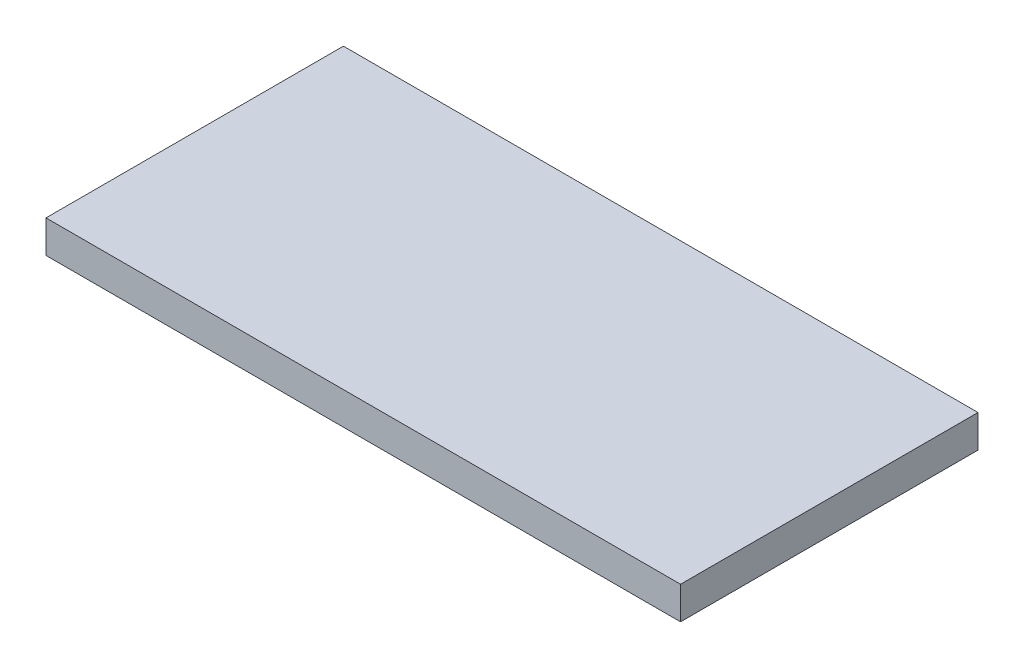
ISO-10303-21;
HEADER;
FILE_DESCRIPTION(('STEP AP214'),'2;1');
FILE_NAME('part.step','',(''),(''),'','','');
FILE_SCHEMA(('AUTOMOTIVE_DESIGN { 1 0 10303 214 1 1 1 1 }'));
ENDSEC;
DATA;
#1=APPLICATION_CONTEXT('core data for automotive mechanical design processes');
#2=APPLICATION_PROTOCOL_DEFINITION('international standard','automotive_design',2000,#1);
#3=PRODUCT_CONTEXT('',#1,'mechanical');
#4=PRODUCT('Part','Part','',(#3));
#5=PRODUCT_RELATED_PRODUCT_CATEGORY('part','',(#4));
#6=PRODUCT_DEFINITION_FORMATION('','',#4);
#7=PRODUCT_DEFINITION_CONTEXT('part definition',#1,'design');
#8=PRODUCT_DEFINITION('design','',#6,#7);
#9=PRODUCT_DEFINITION_SHAPE('','',#8);
#10=(LENGTH_UNIT() NAMED_UNIT(*) SI_UNIT(.MILLI.,.METRE.));
#11=(NAMED_UNIT(*) PLANE_ANGLE_UNIT() SI_UNIT($,.RADIAN.));
#12=(NAMED_UNIT(*) SI_UNIT($,.STERADIAN.) SOLID_ANGLE_UNIT());
#13=UNCERTAINTY_MEASURE_WITH_UNIT(LENGTH_MEASURE(1.E-05),#10,'distance_accuracy_value','');
#14=(GEOMETRIC_REPRESENTATION_CONTEXT(3) GLOBAL_UNCERTAINTY_ASSIGNED_CONTEXT((#13)) GLOBAL_UNIT_ASSIGNED_CONTEXT((#10,
#11,#12)) REPRESENTATION_CONTEXT('',''));
#15=CARTESIAN_POINT('',(0.,0.,0.));
#16=DIRECTION('',(0.,0.,1.));
#17=DIRECTION('',(1.,0.,0.));
#18=AXIS2_PLACEMENT_3D('',#15,#16,#17);
#19=CARTESIAN_POINT('',(-224.,11.5,105.));
#20=DIRECTION('',(1.,0.,0.));
#21=DIRECTION('',(0.,0.,-1.));
#22=AXIS2_PLACEMENT_3D('',#19,#20,#21);
#23=PLANE('',#22);
#24=DIRECTION('',(0.,0.,1.));
#25=VECTOR('',#24,1.);
#26=CARTESIAN_POINT('',(-224.,-11.5,105.));
#27=LINE('',#26,#25);
#28=CARTESIAN_POINT('',(-224.,-11.5,-105.));
#29=VERTEX_POINT('',#28);
#30=CARTESIAN_POINT('',(-224.,-11.5,105.));
#31=VERTEX_POINT('',#30);
#32=EDGE_CURVE('E102',#29,#31,#27,.T.);
#33=ORIENTED_EDGE('',*,*,#32,.T.);
#34=DIRECTION('',(0.,-1.,0.));
#35=VECTOR('',#34,1.);
#36=CARTESIAN_POINT('',(-224.,11.5,105.));
#37=LINE('',#36,#35);
#38=CARTESIAN_POINT('',(-224.,11.5,105.));
#39=VERTEX_POINT('',#38);
#40=EDGE_CURVE('E11',#39,#31,#37,.T.);
#41=ORIENTED_EDGE('',*,*,#40,.F.);
#42=DIRECTION('',(0.,0.,1.));
#43=VECTOR('',#42,1.);
#44=CARTESIAN_POINT('',(-224.,11.5,105.));
#45=LINE('',#44,#43);
#46=CARTESIAN_POINT('',(-224.,11.5,-105.));
#47=VERTEX_POINT('',#46);
#48=EDGE_CURVE('E90',#47,#39,#45,.T.);
#49=ORIENTED_EDGE('',*,*,#48,.F.);
#50=DIRECTION('',(0.,-1.,0.));
#51=VECTOR('',#50,1.);
#52=CARTESIAN_POINT('',(-224.,11.5,-105.));
#53=LINE('',#52,#51);
#54=EDGE_CURVE('E98',#47,#29,#53,.T.);
#55=ORIENTED_EDGE('',*,*,#54,.T.);
#56=EDGE_LOOP('',(#33,#41,#49,#55));
#57=FACE_BOUND('',#56,.T.);
#58=ADVANCED_FACE('F39',(#57),#23,.F.);
#59=CARTESIAN_POINT('',(224.,11.5,105.));
#60=DIRECTION('',(0.,0.,-1.));
#61=DIRECTION('',(-1.,0.,0.));
#62=AXIS2_PLACEMENT_3D('',#59,#60,#61);
#63=PLANE('',#62);
#64=DIRECTION('',(1.,0.,0.));
#65=VECTOR('',#64,1.);
#66=CARTESIAN_POINT('',(224.,-11.5,105.));
#67=LINE('',#66,#65);
#68=CARTESIAN_POINT('',(224.,-11.5,105.));
#69=VERTEX_POINT('',#68);
#70=EDGE_CURVE('E94',#31,#69,#67,.T.);
#71=ORIENTED_EDGE('',*,*,#70,.T.);
#72=DIRECTION('',(0.,-1.,0.));
#73=VECTOR('',#72,1.);
#74=CARTESIAN_POINT('',(224.,11.5,105.));
#75=LINE('',#74,#73);
#76=CARTESIAN_POINT('',(224.,11.5,105.));
#77=VERTEX_POINT('',#76);
#78=EDGE_CURVE('E47',#77,#69,#75,.T.);
#79=ORIENTED_EDGE('',*,*,#78,.F.);
#80=DIRECTION('',(1.,0.,0.));
#81=VECTOR('',#80,1.);
#82=CARTESIAN_POINT('',(224.,11.5,105.));
#83=LINE('',#82,#81);
#84=EDGE_CURVE('E85',#39,#77,#83,.T.);
#85=ORIENTED_EDGE('',*,*,#84,.F.);
#86=ORIENTED_EDGE('',*,*,#40,.T.);
#87=EDGE_LOOP('',(#71,#79,#85,#86));
#88=FACE_BOUND('',#87,.T.);
#89=ADVANCED_FACE('F93',(#88),#63,.F.);
#90=CARTESIAN_POINT('',(224.,11.5,-105.));
#91=DIRECTION('',(-1.,0.,0.));
#92=DIRECTION('',(0.,0.,1.));
#93=AXIS2_PLACEMENT_3D('',#90,#91,#92);
#94=PLANE('',#93);
#95=DIRECTION('',(0.,0.,-1.));
#96=VECTOR('',#95,1.);
#97=CARTESIAN_POINT('',(224.,-11.5,-105.));
#98=LINE('',#97,#96);
#99=CARTESIAN_POINT('',(224.,-11.5,-105.));
#100=VERTEX_POINT('',#99);
#101=EDGE_CURVE('E72',#69,#100,#98,.T.);
#102=ORIENTED_EDGE('',*,*,#101,.T.);
#103=DIRECTION('',(0.,-1.,0.));
#104=VECTOR('',#103,1.);
#105=CARTESIAN_POINT('',(224.,11.5,-105.));
#106=LINE('',#105,#104);
#107=CARTESIAN_POINT('',(224.,11.5,-105.));
#108=VERTEX_POINT('',#107);
#109=EDGE_CURVE('E95',#108,#100,#106,.T.);
#110=ORIENTED_EDGE('',*,*,#109,.F.);
#111=DIRECTION('',(0.,0.,-1.));
#112=VECTOR('',#111,1.);
#113=CARTESIAN_POINT('',(224.,11.5,-105.));
#114=LINE('',#113,#112);
#115=EDGE_CURVE('E88',#77,#108,#114,.T.);
#116=ORIENTED_EDGE('',*,*,#115,.F.);
#117=ORIENTED_EDGE('',*,*,#78,.T.);
#118=EDGE_LOOP('',(#102,#110,#116,#117));
#119=FACE_BOUND('',#118,.T.);
#120=ADVANCED_FACE('F96',(#119),#94,.F.);
#121=CARTESIAN_POINT('',(-224.,11.5,-105.));
#122=DIRECTION('',(0.,0.,1.));
#123=DIRECTION('',(1.,0.,0.));
#124=AXIS2_PLACEMENT_3D('',#121,#122,#123);
#125=PLANE('',#124);
#126=DIRECTION('',(-1.,0.,0.));
#127=VECTOR('',#126,1.);
#128=CARTESIAN_POINT('',(-224.,-11.5,-105.));
#129=LINE('',#128,#127);
#130=EDGE_CURVE('E78',#100,#29,#129,.T.);
#131=ORIENTED_EDGE('',*,*,#130,.T.);
#132=ORIENTED_EDGE('',*,*,#54,.F.);
#133=DIRECTION('',(-1.,0.,0.));
#134=VECTOR('',#133,1.);
#135=CARTESIAN_POINT('',(-224.,11.5,-105.));
#136=LINE('',#135,#134);
#137=EDGE_CURVE('E55',#108,#47,#136,.T.);
#138=ORIENTED_EDGE('',*,*,#137,.F.);
#139=ORIENTED_EDGE('',*,*,#109,.T.);
#140=EDGE_LOOP('',(#131,#132,#138,#139));
#141=FACE_BOUND('',#140,.T.);
#142=ADVANCED_FACE('F109',(#141),#125,.F.);
#143=CARTESIAN_POINT('',(0.,11.5,0.));
#144=DIRECTION('',(0.,-1.,0.));
#145=DIRECTION('',(0.,0.,-1.));
#146=AXIS2_PLACEMENT_3D('',#143,#144,#145);
#147=PLANE('',#146);
#148=ORIENTED_EDGE('',*,*,#48,.T.);
#149=ORIENTED_EDGE('',*,*,#84,.T.);
#150=ORIENTED_EDGE('',*,*,#115,.T.);
#151=ORIENTED_EDGE('',*,*,#137,.T.);
#152=EDGE_LOOP('',(#148,#149,#150,#151));
#153=FACE_BOUND('',#152,.T.);
#154=ADVANCED_FACE('F86',(#153),#147,.F.);
#155=CARTESIAN_POINT('',(0.,-11.5,0.));
#156=DIRECTION('',(0.,-1.,0.));
#157=DIRECTION('',(0.,0.,-1.));
#158=AXIS2_PLACEMENT_3D('',#155,#156,#157);
#159=PLANE('',#158);
#160=ORIENTED_EDGE('',*,*,#32,.F.);
#161=ORIENTED_EDGE('',*,*,#130,.F.);
#162=ORIENTED_EDGE('',*,*,#101,.F.);
#163=ORIENTED_EDGE('',*,*,#70,.F.);
#164=EDGE_LOOP('',(#160,#161,#162,#163));
#165=FACE_BOUND('',#164,.T.);
#166=ADVANCED_FACE('F112',(#165),#159,.T.);
#167=CLOSED_SHELL('',(#58,#89,#120,#142,#154,#166));
#168=MANIFOLD_SOLID_BREP('B2',#167);
#169=ADVANCED_BREP_SHAPE_REPRESENTATION('',(#18,#168),#14);
#170=SHAPE_DEFINITION_REPRESENTATION(#9,#169);
ENDSEC;
END-ISO-10303-21;
